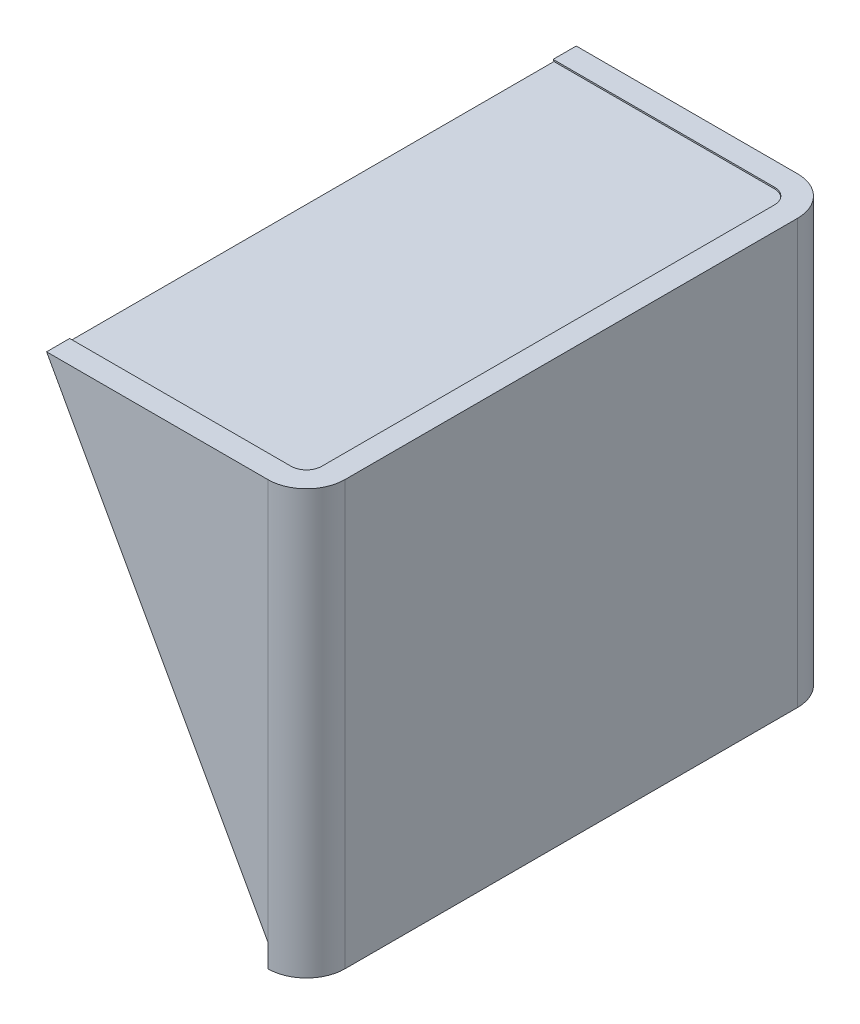
ISO-10303-21;
HEADER;
FILE_DESCRIPTION(('STEP AP214'),'2;1');
FILE_NAME('part.step','',(''),(''),'','','');
FILE_SCHEMA(('AUTOMOTIVE_DESIGN { 1 0 10303 214 1 1 1 1 }'));
ENDSEC;
DATA;
#1=APPLICATION_CONTEXT('core data for automotive mechanical design processes');
#2=APPLICATION_PROTOCOL_DEFINITION('international standard','automotive_design',2000,#1);
#3=PRODUCT_CONTEXT('',#1,'mechanical');
#4=PRODUCT('Part','Part','',(#3));
#5=PRODUCT_RELATED_PRODUCT_CATEGORY('part','',(#4));
#6=PRODUCT_DEFINITION_FORMATION('','',#4);
#7=PRODUCT_DEFINITION_CONTEXT('part definition',#1,'design');
#8=PRODUCT_DEFINITION('design','',#6,#7);
#9=PRODUCT_DEFINITION_SHAPE('','',#8);
#10=(LENGTH_UNIT() NAMED_UNIT(*) SI_UNIT(.MILLI.,.METRE.));
#11=(NAMED_UNIT(*) PLANE_ANGLE_UNIT() SI_UNIT($,.RADIAN.));
#12=(NAMED_UNIT(*) SI_UNIT($,.STERADIAN.) SOLID_ANGLE_UNIT());
#13=UNCERTAINTY_MEASURE_WITH_UNIT(LENGTH_MEASURE(1.E-05),#10,'distance_accuracy_value','');
#14=(GEOMETRIC_REPRESENTATION_CONTEXT(3) GLOBAL_UNCERTAINTY_ASSIGNED_CONTEXT((#13)) GLOBAL_UNIT_ASSIGNED_CONTEXT((#10,
#11,#12)) REPRESENTATION_CONTEXT('',''));
#15=CARTESIAN_POINT('',(0.,0.,0.));
#16=DIRECTION('',(0.,0.,1.));
#17=DIRECTION('',(1.,0.,0.));
#18=AXIS2_PLACEMENT_3D('',#15,#16,#17);
#19=CARTESIAN_POINT('',(47.5,3.,-34.385));
#20=DIRECTION('',(0.875294555883679,0.483590157509841,0.));
#21=DIRECTION('',(-0.483590157509841,0.875294555883679,0.));
#22=AXIS2_PLACEMENT_3D('',#19,#20,#21);
#23=PLANE('',#22);
#24=DIRECTION('',(0.,0.,1.));
#25=VECTOR('',#24,1.);
#26=CARTESIAN_POINT('',(47.5,3.,-34.385));
#27=LINE('',#26,#25);
#28=CARTESIAN_POINT('',(47.5,3.,-34.375));
#29=VERTEX_POINT('',#28);
#30=CARTESIAN_POINT('',(47.5,3.,-31.375));
#31=VERTEX_POINT('',#30);
#32=EDGE_CURVE('E48',#29,#31,#27,.T.);
#33=ORIENTED_EDGE('',*,*,#32,.T.);
#34=DIRECTION('',(-0.483590157509841,0.875294555883679,0.));
#35=VECTOR('',#34,1.);
#36=CARTESIAN_POINT('',(25.4892407283406,42.8393090970996,-31.375));
#37=LINE('',#36,#35);
#38=CARTESIAN_POINT('',(20.5349382977375,51.8065593158347,-31.3750000000004));
#39=VERTEX_POINT('',#38);
#40=EDGE_CURVE('E63',#31,#39,#37,.T.);
#41=ORIENTED_EDGE('',*,*,#40,.T.);
#42=DIRECTION('',(0.,0.,1.));
#43=VECTOR('',#42,1.);
#44=CARTESIAN_POINT('',(20.5349382977375,51.8065593158347,-29.375));
#45=LINE('',#44,#43);
#46=CARTESIAN_POINT('',(20.5349382977375,51.8065593158347,31.375));
#47=VERTEX_POINT('',#46);
#48=EDGE_CURVE('E262',#39,#47,#45,.T.);
#49=ORIENTED_EDGE('',*,*,#48,.T.);
#50=DIRECTION('',(0.483590157509841,-0.875294555883679,0.));
#51=VECTOR('',#50,1.);
#52=CARTESIAN_POINT('',(25.4892407283406,42.8393090970996,31.375));
#53=LINE('',#52,#51);
#54=CARTESIAN_POINT('',(47.5,3.,31.375));
#55=VERTEX_POINT('',#54);
#56=EDGE_CURVE('E55',#47,#55,#53,.T.);
#57=ORIENTED_EDGE('',*,*,#56,.T.);
#58=CARTESIAN_POINT('',(47.5,3.,34.375));
#59=VERTEX_POINT('',#58);
#60=EDGE_CURVE('E11',#55,#59,#27,.T.);
#61=ORIENTED_EDGE('',*,*,#60,.T.);
#62=DIRECTION('',(0.483590157509841,-0.875294555883679,0.));
#63=VECTOR('',#62,1.);
#64=CARTESIAN_POINT('',(25.4892407283406,42.8393090970996,34.375));
#65=LINE('',#64,#63);
#66=CARTESIAN_POINT('',(18.7705991126334,55.,34.375));
#67=VERTEX_POINT('',#66);
#68=EDGE_CURVE('E267',#67,#59,#65,.T.);
#69=ORIENTED_EDGE('',*,*,#68,.F.);
#70=DIRECTION('',(0.,0.,1.));
#71=VECTOR('',#70,1.);
#72=CARTESIAN_POINT('',(18.7705991126334,55.,29.375));
#73=LINE('',#72,#71);
#74=CARTESIAN_POINT('',(18.7705991126334,55.,31.375));
#75=VERTEX_POINT('',#74);
#76=EDGE_CURVE('E269',#75,#67,#73,.T.);
#77=ORIENTED_EDGE('',*,*,#76,.F.);
#78=DIRECTION('',(0.483590157509841,-0.875294555883679,0.));
#79=VECTOR('',#78,1.);
#80=CARTESIAN_POINT('',(25.4892407283406,42.8393090970996,31.375));
#81=LINE('',#80,#79);
#82=CARTESIAN_POINT('',(18.8774728619278,54.8065593158347,31.375));
#83=VERTEX_POINT('',#82);
#84=EDGE_CURVE('E273',#75,#83,#81,.T.);
#85=ORIENTED_EDGE('',*,*,#84,.T.);
#86=DIRECTION('',(0.,0.,1.));
#87=VECTOR('',#86,1.);
#88=CARTESIAN_POINT('',(18.8774728619278,54.8065593158347,-29.375));
#89=LINE('',#88,#87);
#90=CARTESIAN_POINT('',(18.8774728619278,54.8065593158347,-31.3750000000004));
#91=VERTEX_POINT('',#90);
#92=EDGE_CURVE('E261',#91,#83,#89,.T.);
#93=ORIENTED_EDGE('',*,*,#92,.F.);
#94=DIRECTION('',(-0.483590157509841,0.875294555883679,0.));
#95=VECTOR('',#94,1.);
#96=CARTESIAN_POINT('',(25.4892407283406,42.8393090970996,-31.375));
#97=LINE('',#96,#95);
#98=CARTESIAN_POINT('',(18.7705991126334,55.,-31.375));
#99=VERTEX_POINT('',#98);
#100=EDGE_CURVE('E277',#91,#99,#97,.T.);
#101=ORIENTED_EDGE('',*,*,#100,.T.);
#102=CARTESIAN_POINT('',(18.7705991126334,55.,-34.375));
#103=VERTEX_POINT('',#102);
#104=EDGE_CURVE('E271',#103,#99,#73,.T.);
#105=ORIENTED_EDGE('',*,*,#104,.F.);
#106=DIRECTION('',(-0.483590157509841,0.875294555883679,0.));
#107=VECTOR('',#106,1.);
#108=CARTESIAN_POINT('',(25.4892407283406,42.8393090970996,-34.375));
#109=LINE('',#108,#107);
#110=EDGE_CURVE('E43',#29,#103,#109,.T.);
#111=ORIENTED_EDGE('',*,*,#110,.F.);
#112=EDGE_LOOP('',(#33,#41,#49,#57,#61,#69,#77,#85,#93,#101,#105,#111));
#113=FACE_BOUND('',#112,.T.);
#114=ADVANCED_FACE('F39',(#113),#23,.F.);
#115=CARTESIAN_POINT('',(47.5,0.,-34.385));
#116=DIRECTION('',(1.,0.,0.));
#117=DIRECTION('',(0.,0.,-1.));
#118=AXIS2_PLACEMENT_3D('',#115,#116,#117);
#119=PLANE('',#118);
#120=DIRECTION('',(0.,0.,1.));
#121=VECTOR('',#120,1.);
#122=CARTESIAN_POINT('',(47.5,0.,29.375));
#123=LINE('',#122,#121);
#124=CARTESIAN_POINT('',(47.5,0.,-34.375));
#125=VERTEX_POINT('',#124);
#126=CARTESIAN_POINT('',(47.5,0.,34.375));
#127=VERTEX_POINT('',#126);
#128=EDGE_CURVE('E264',#125,#127,#123,.T.);
#129=ORIENTED_EDGE('',*,*,#128,.T.);
#130=DIRECTION('',(0.,-1.,0.));
#131=VECTOR('',#130,1.);
#132=CARTESIAN_POINT('',(47.5,55.,34.375));
#133=LINE('',#132,#131);
#134=EDGE_CURVE('E257',#59,#127,#133,.T.);
#135=ORIENTED_EDGE('',*,*,#134,.F.);
#136=ORIENTED_EDGE('',*,*,#60,.F.);
#137=DIRECTION('',(0.,0.,1.));
#138=VECTOR('',#137,1.);
#139=CARTESIAN_POINT('',(47.5,3.,29.375));
#140=LINE('',#139,#138);
#141=EDGE_CURVE('E272',#31,#55,#140,.T.);
#142=ORIENTED_EDGE('',*,*,#141,.F.);
#143=ORIENTED_EDGE('',*,*,#32,.F.);
#144=DIRECTION('',(0.,-1.,0.));
#145=VECTOR('',#144,1.);
#146=CARTESIAN_POINT('',(47.5,55.,-34.375));
#147=LINE('',#146,#145);
#148=EDGE_CURVE('E251',#29,#125,#147,.T.);
#149=ORIENTED_EDGE('',*,*,#148,.T.);
#150=EDGE_LOOP('',(#129,#135,#136,#142,#143,#149));
#151=FACE_BOUND('',#150,.T.);
#152=ADVANCED_FACE('F41',(#151),#119,.F.);
#153=CARTESIAN_POINT('',(47.5,55.,31.375));
#154=DIRECTION('',(0.,0.,-1.));
#155=DIRECTION('',(-1.,0.,0.));
#156=AXIS2_PLACEMENT_3D('',#153,#154,#155);
#157=PLANE('',#156);
#158=ORIENTED_EDGE('',*,*,#56,.F.);
#159=DIRECTION('',(1.,0.,0.));
#160=VECTOR('',#159,1.);
#161=CARTESIAN_POINT('',(18.7705991126334,51.8065593158347,31.375));
#162=LINE('',#161,#160);
#163=CARTESIAN_POINT('',(47.5,51.8065593158347,31.375));
#164=VERTEX_POINT('',#163);
#165=EDGE_CURVE('E329',#47,#164,#162,.T.);
#166=ORIENTED_EDGE('',*,*,#165,.T.);
#167=DIRECTION('',(0.,-1.,0.));
#168=VECTOR('',#167,1.);
#169=CARTESIAN_POINT('',(47.5,55.,31.375));
#170=LINE('',#169,#168);
#171=EDGE_CURVE('E208',#164,#55,#170,.T.);
#172=ORIENTED_EDGE('',*,*,#171,.T.);
#173=EDGE_LOOP('',(#158,#166,#172));
#174=FACE_BOUND('',#173,.T.);
#175=ADVANCED_FACE('F338',(#174),#157,.T.);
#176=CARTESIAN_POINT('',(47.5,55.,29.375));
#177=DIRECTION('',(0.,-1.,0.));
#178=DIRECTION('',(0.,0.,-1.));
#179=AXIS2_PLACEMENT_3D('',#176,#177,#178);
#180=CYLINDRICAL_SURFACE('',#179,2.);
#181=CARTESIAN_POINT('',(47.5,51.8065593158347,29.375));
#182=DIRECTION('',(0.,1.,0.));
#183=DIRECTION('',(0.,0.,-1.));
#184=AXIS2_PLACEMENT_3D('',#181,#182,#183);
#185=CIRCLE('',#184,2.00000000000001);
#186=CARTESIAN_POINT('',(49.5,51.8065593158347,29.375));
#187=VERTEX_POINT('',#186);
#188=EDGE_CURVE('E182',#164,#187,#185,.T.);
#189=ORIENTED_EDGE('',*,*,#188,.T.);
#190=DIRECTION('',(0.,1.,0.));
#191=VECTOR('',#190,1.);
#192=CARTESIAN_POINT('',(49.5,55.,29.375));
#193=LINE('',#192,#191);
#194=CARTESIAN_POINT('',(49.5,3.,29.375));
#195=VERTEX_POINT('',#194);
#196=EDGE_CURVE('E179',#187,#195,#193,.F.);
#197=ORIENTED_EDGE('',*,*,#196,.T.);
#198=CARTESIAN_POINT('',(47.5,3.,29.375));
#199=DIRECTION('',(0.,-1.,0.));
#200=DIRECTION('',(0.,0.,-1.));
#201=AXIS2_PLACEMENT_3D('',#198,#199,#200);
#202=CIRCLE('',#201,2.);
#203=EDGE_CURVE('E187',#55,#195,#202,.F.);
#204=ORIENTED_EDGE('',*,*,#203,.F.);
#205=ORIENTED_EDGE('',*,*,#171,.F.);
#206=EDGE_LOOP('',(#189,#197,#204,#205));
#207=FACE_BOUND('',#206,.T.);
#208=ADVANCED_FACE('F334',(#207),#180,.F.);
#209=CARTESIAN_POINT('',(49.5,55.,29.375));
#210=DIRECTION('',(-1.,0.,0.));
#211=DIRECTION('',(0.,0.,1.));
#212=AXIS2_PLACEMENT_3D('',#209,#210,#211);
#213=PLANE('',#212);
#214=DIRECTION('',(0.,0.,-1.));
#215=VECTOR('',#214,1.);
#216=CARTESIAN_POINT('',(49.5,51.8065593158347,-29.375));
#217=LINE('',#216,#215);
#218=CARTESIAN_POINT('',(49.5,51.8065593158347,-29.375));
#219=VERTEX_POINT('',#218);
#220=EDGE_CURVE('E177',#187,#219,#217,.T.);
#221=ORIENTED_EDGE('',*,*,#220,.T.);
#222=DIRECTION('',(0.,-1.,0.));
#223=VECTOR('',#222,1.);
#224=CARTESIAN_POINT('',(49.5,55.,-29.375));
#225=LINE('',#224,#223);
#226=CARTESIAN_POINT('',(49.5,3.,-29.375));
#227=VERTEX_POINT('',#226);
#228=EDGE_CURVE('E161',#219,#227,#225,.T.);
#229=ORIENTED_EDGE('',*,*,#228,.T.);
#230=DIRECTION('',(0.,0.,-1.));
#231=VECTOR('',#230,1.);
#232=CARTESIAN_POINT('',(49.5,3.,29.375));
#233=LINE('',#232,#231);
#234=EDGE_CURVE('E190',#195,#227,#233,.T.);
#235=ORIENTED_EDGE('',*,*,#234,.F.);
#236=ORIENTED_EDGE('',*,*,#196,.F.);
#237=EDGE_LOOP('',(#221,#229,#235,#236));
#238=FACE_BOUND('',#237,.T.);
#239=ADVANCED_FACE('F178',(#238),#213,.T.);
#240=CARTESIAN_POINT('',(47.5,55.,-29.375));
#241=DIRECTION('',(0.,-1.,0.));
#242=DIRECTION('',(0.,0.,-1.));
#243=AXIS2_PLACEMENT_3D('',#240,#241,#242);
#244=CYLINDRICAL_SURFACE('',#243,2.);
#245=CARTESIAN_POINT('',(47.5,51.8065593158347,-29.375));
#246=DIRECTION('',(0.,1.,0.));
#247=DIRECTION('',(0.,0.,-1.));
#248=AXIS2_PLACEMENT_3D('',#245,#246,#247);
#249=CIRCLE('',#248,2.00000000000003);
#250=CARTESIAN_POINT('',(47.5,51.8065593158347,-31.375));
#251=VERTEX_POINT('',#250);
#252=EDGE_CURVE('E166',#219,#251,#249,.T.);
#253=ORIENTED_EDGE('',*,*,#252,.T.);
#254=DIRECTION('',(0.,1.,0.));
#255=VECTOR('',#254,1.);
#256=CARTESIAN_POINT('',(47.5,55.,-31.375));
#257=LINE('',#256,#255);
#258=EDGE_CURVE('E219',#251,#31,#257,.F.);
#259=ORIENTED_EDGE('',*,*,#258,.T.);
#260=CARTESIAN_POINT('',(47.5,3.,-29.375));
#261=DIRECTION('',(0.,-1.,0.));
#262=DIRECTION('',(0.,0.,-1.));
#263=AXIS2_PLACEMENT_3D('',#260,#261,#262);
#264=CIRCLE('',#263,2.);
#265=EDGE_CURVE('E168',#227,#31,#264,.F.);
#266=ORIENTED_EDGE('',*,*,#265,.F.);
#267=ORIENTED_EDGE('',*,*,#228,.F.);
#268=EDGE_LOOP('',(#253,#259,#266,#267));
#269=FACE_BOUND('',#268,.T.);
#270=ADVANCED_FACE('F163',(#269),#244,.F.);
#271=CARTESIAN_POINT('',(47.5,55.,-31.375));
#272=DIRECTION('',(0.,0.,1.));
#273=DIRECTION('',(1.,0.,0.));
#274=AXIS2_PLACEMENT_3D('',#271,#272,#273);
#275=PLANE('',#274);
#276=ORIENTED_EDGE('',*,*,#40,.F.);
#277=ORIENTED_EDGE('',*,*,#258,.F.);
#278=DIRECTION('',(-1.,0.,0.));
#279=VECTOR('',#278,1.);
#280=CARTESIAN_POINT('',(18.7705991126334,51.8065593158347,-31.3750000000004));
#281=LINE('',#280,#279);
#282=EDGE_CURVE('E186',#251,#39,#281,.T.);
#283=ORIENTED_EDGE('',*,*,#282,.T.);
#284=EDGE_LOOP('',(#276,#277,#283));
#285=FACE_BOUND('',#284,.T.);
#286=ADVANCED_FACE('F328',(#285),#275,.T.);
#287=CARTESIAN_POINT('',(47.5,51.8065593158347,-29.375));
#288=DIRECTION('',(0.,-1.,0.));
#289=DIRECTION('',(0.,0.,-1.));
#290=AXIS2_PLACEMENT_3D('',#287,#288,#289);
#291=PLANE('',#290);
#292=ORIENTED_EDGE('',*,*,#48,.F.);
#293=ORIENTED_EDGE('',*,*,#282,.F.);
#294=ORIENTED_EDGE('',*,*,#252,.F.);
#295=ORIENTED_EDGE('',*,*,#220,.F.);
#296=ORIENTED_EDGE('',*,*,#188,.F.);
#297=ORIENTED_EDGE('',*,*,#165,.F.);
#298=EDGE_LOOP('',(#292,#293,#294,#295,#296,#297));
#299=FACE_BOUND('',#298,.T.);
#300=ADVANCED_FACE('F185',(#299),#291,.T.);
#301=CARTESIAN_POINT('',(-47.5,3.,29.375));
#302=DIRECTION('',(0.,-1.,0.));
#303=DIRECTION('',(0.,0.,-1.));
#304=AXIS2_PLACEMENT_3D('',#301,#302,#303);
#305=PLANE('',#304);
#306=ORIENTED_EDGE('',*,*,#265,.T.);
#307=ORIENTED_EDGE('',*,*,#141,.T.);
#308=ORIENTED_EDGE('',*,*,#203,.T.);
#309=ORIENTED_EDGE('',*,*,#234,.T.);
#310=EDGE_LOOP('',(#306,#307,#308,#309));
#311=FACE_BOUND('',#310,.T.);
#312=ADVANCED_FACE('F376',(#311),#305,.F.);
#313=CARTESIAN_POINT('',(47.5,55.,-31.375));
#314=VERTEX_POINT('',#313);
#315=CARTESIAN_POINT('',(47.5,54.8065593158347,-31.375));
#316=VERTEX_POINT('',#315);
#317=EDGE_CURVE('E173',#314,#316,#257,.F.);
#318=ORIENTED_EDGE('',*,*,#317,.T.);
#319=CARTESIAN_POINT('',(47.5,54.8065593158347,-29.375));
#320=DIRECTION('',(0.,1.,0.));
#321=DIRECTION('',(0.,0.,-1.));
#322=AXIS2_PLACEMENT_3D('',#319,#320,#321);
#323=CIRCLE('',#322,2.00000000000003);
#324=CARTESIAN_POINT('',(49.5,54.8065593158347,-29.375));
#325=VERTEX_POINT('',#324);
#326=EDGE_CURVE('E203',#325,#316,#323,.T.);
#327=ORIENTED_EDGE('',*,*,#326,.F.);
#328=CARTESIAN_POINT('',(49.5,55.,-29.375));
#329=VERTEX_POINT('',#328);
#330=EDGE_CURVE('E172',#329,#325,#225,.T.);
#331=ORIENTED_EDGE('',*,*,#330,.F.);
#332=CARTESIAN_POINT('',(47.5,55.,-29.375));
#333=DIRECTION('',(0.,-1.,0.));
#334=DIRECTION('',(0.,0.,-1.));
#335=AXIS2_PLACEMENT_3D('',#332,#333,#334);
#336=CIRCLE('',#335,2.);
#337=EDGE_CURVE('E225',#329,#314,#336,.F.);
#338=ORIENTED_EDGE('',*,*,#337,.T.);
#339=EDGE_LOOP('',(#318,#327,#331,#338));
#340=FACE_BOUND('',#339,.T.);
#341=ADVANCED_FACE('F307',(#340),#244,.F.);
#342=ORIENTED_EDGE('',*,*,#330,.T.);
#343=DIRECTION('',(0.,0.,-1.));
#344=VECTOR('',#343,1.);
#345=CARTESIAN_POINT('',(49.5,54.8065593158347,-29.375));
#346=LINE('',#345,#344);
#347=CARTESIAN_POINT('',(49.5,54.8065593158347,29.375));
#348=VERTEX_POINT('',#347);
#349=EDGE_CURVE('E201',#348,#325,#346,.T.);
#350=ORIENTED_EDGE('',*,*,#349,.F.);
#351=CARTESIAN_POINT('',(49.5,55.,29.375));
#352=VERTEX_POINT('',#351);
#353=EDGE_CURVE('E210',#352,#348,#193,.F.);
#354=ORIENTED_EDGE('',*,*,#353,.F.);
#355=DIRECTION('',(0.,0.,-1.));
#356=VECTOR('',#355,1.);
#357=CARTESIAN_POINT('',(49.5,55.,29.375));
#358=LINE('',#357,#356);
#359=EDGE_CURVE('E223',#352,#329,#358,.T.);
#360=ORIENTED_EDGE('',*,*,#359,.T.);
#361=EDGE_LOOP('',(#342,#350,#354,#360));
#362=FACE_BOUND('',#361,.T.);
#363=ADVANCED_FACE('F299',(#362),#213,.T.);
#364=ORIENTED_EDGE('',*,*,#353,.T.);
#365=CARTESIAN_POINT('',(47.5,54.8065593158347,29.375));
#366=DIRECTION('',(0.,1.,0.));
#367=DIRECTION('',(0.,0.,-1.));
#368=AXIS2_PLACEMENT_3D('',#365,#366,#367);
#369=CIRCLE('',#368,2.00000000000001);
#370=CARTESIAN_POINT('',(47.5,54.8065593158347,31.375));
#371=VERTEX_POINT('',#370);
#372=EDGE_CURVE('E199',#371,#348,#369,.T.);
#373=ORIENTED_EDGE('',*,*,#372,.F.);
#374=CARTESIAN_POINT('',(47.5,55.,31.375));
#375=VERTEX_POINT('',#374);
#376=EDGE_CURVE('E205',#375,#371,#170,.T.);
#377=ORIENTED_EDGE('',*,*,#376,.F.);
#378=CARTESIAN_POINT('',(47.5,55.,29.375));
#379=DIRECTION('',(0.,-1.,0.));
#380=DIRECTION('',(0.,0.,-1.));
#381=AXIS2_PLACEMENT_3D('',#378,#379,#380);
#382=CIRCLE('',#381,2.);
#383=EDGE_CURVE('E221',#375,#352,#382,.F.);
#384=ORIENTED_EDGE('',*,*,#383,.T.);
#385=EDGE_LOOP('',(#364,#373,#377,#384));
#386=FACE_BOUND('',#385,.T.);
#387=ADVANCED_FACE('F294',(#386),#180,.F.);
#388=ORIENTED_EDGE('',*,*,#84,.F.);
#389=DIRECTION('',(1.,0.,0.));
#390=VECTOR('',#389,1.);
#391=CARTESIAN_POINT('',(-47.5,55.,31.375));
#392=LINE('',#391,#390);
#393=EDGE_CURVE('E216',#75,#375,#392,.T.);
#394=ORIENTED_EDGE('',*,*,#393,.T.);
#395=ORIENTED_EDGE('',*,*,#376,.T.);
#396=DIRECTION('',(1.,0.,0.));
#397=VECTOR('',#396,1.);
#398=CARTESIAN_POINT('',(18.7705991126334,54.8065593158347,31.375));
#399=LINE('',#398,#397);
#400=EDGE_CURVE('E197',#83,#371,#399,.T.);
#401=ORIENTED_EDGE('',*,*,#400,.F.);
#402=EDGE_LOOP('',(#388,#394,#395,#401));
#403=FACE_BOUND('',#402,.T.);
#404=ADVANCED_FACE('F287',(#403),#157,.T.);
#405=ORIENTED_EDGE('',*,*,#100,.F.);
#406=DIRECTION('',(-1.,0.,0.));
#407=VECTOR('',#406,1.);
#408=CARTESIAN_POINT('',(18.7705991126334,54.8065593158347,-31.3750000000004));
#409=LINE('',#408,#407);
#410=EDGE_CURVE('E194',#316,#91,#409,.T.);
#411=ORIENTED_EDGE('',*,*,#410,.F.);
#412=ORIENTED_EDGE('',*,*,#317,.F.);
#413=DIRECTION('',(-1.,0.,0.));
#414=VECTOR('',#413,1.);
#415=CARTESIAN_POINT('',(-47.5,55.,-31.375));
#416=LINE('',#415,#414);
#417=EDGE_CURVE('E227',#314,#99,#416,.T.);
#418=ORIENTED_EDGE('',*,*,#417,.T.);
#419=EDGE_LOOP('',(#405,#411,#412,#418));
#420=FACE_BOUND('',#419,.T.);
#421=ADVANCED_FACE('F311',(#420),#275,.T.);
#422=CARTESIAN_POINT('',(47.5,54.8065593158347,-29.375));
#423=DIRECTION('',(0.,-1.,0.));
#424=DIRECTION('',(0.,0.,-1.));
#425=AXIS2_PLACEMENT_3D('',#422,#423,#424);
#426=PLANE('',#425);
#427=ORIENTED_EDGE('',*,*,#410,.T.);
#428=ORIENTED_EDGE('',*,*,#92,.T.);
#429=ORIENTED_EDGE('',*,*,#400,.T.);
#430=ORIENTED_EDGE('',*,*,#372,.T.);
#431=ORIENTED_EDGE('',*,*,#349,.T.);
#432=ORIENTED_EDGE('',*,*,#326,.T.);
#433=EDGE_LOOP('',(#427,#428,#429,#430,#431,#432));
#434=FACE_BOUND('',#433,.T.);
#435=ADVANCED_FACE('F291',(#434),#426,.F.);
#436=CARTESIAN_POINT('',(47.5,55.,34.375));
#437=DIRECTION('',(0.,0.,-1.));
#438=DIRECTION('',(-1.,0.,0.));
#439=AXIS2_PLACEMENT_3D('',#436,#437,#438);
#440=PLANE('',#439);
#441=DIRECTION('',(1.,0.,0.));
#442=VECTOR('',#441,1.);
#443=CARTESIAN_POINT('',(47.5,55.,34.375));
#444=LINE('',#443,#442);
#445=CARTESIAN_POINT('',(47.5,55.,34.375));
#446=VERTEX_POINT('',#445);
#447=EDGE_CURVE('E230',#67,#446,#444,.T.);
#448=ORIENTED_EDGE('',*,*,#447,.F.);
#449=ORIENTED_EDGE('',*,*,#68,.T.);
#450=EDGE_CURVE('E258',#446,#59,#133,.T.);
#451=ORIENTED_EDGE('',*,*,#450,.F.);
#452=EDGE_LOOP('',(#448,#449,#451));
#453=FACE_BOUND('',#452,.T.);
#454=ADVANCED_FACE('F354',(#453),#440,.F.);
#455=CARTESIAN_POINT('',(-47.5,55.,29.375));
#456=DIRECTION('',(0.,-1.,0.));
#457=DIRECTION('',(0.,0.,-1.));
#458=AXIS2_PLACEMENT_3D('',#455,#456,#457);
#459=PLANE('',#458);
#460=DIRECTION('',(-1.,0.,0.));
#461=VECTOR('',#460,1.);
#462=CARTESIAN_POINT('',(47.5,55.,-34.375));
#463=LINE('',#462,#461);
#464=CARTESIAN_POINT('',(47.5,55.,-34.375));
#465=VERTEX_POINT('',#464);
#466=EDGE_CURVE('E239',#465,#103,#463,.T.);
#467=ORIENTED_EDGE('',*,*,#466,.T.);
#468=ORIENTED_EDGE('',*,*,#104,.T.);
#469=ORIENTED_EDGE('',*,*,#417,.F.);
#470=ORIENTED_EDGE('',*,*,#337,.F.);
#471=ORIENTED_EDGE('',*,*,#359,.F.);
#472=ORIENTED_EDGE('',*,*,#383,.F.);
#473=ORIENTED_EDGE('',*,*,#393,.F.);
#474=ORIENTED_EDGE('',*,*,#76,.T.);
#475=ORIENTED_EDGE('',*,*,#447,.T.);
#476=CARTESIAN_POINT('',(47.5,55.,29.375));
#477=DIRECTION('',(0.,1.,0.));
#478=DIRECTION('',(0.,0.,1.));
#479=AXIS2_PLACEMENT_3D('',#476,#477,#478);
#480=CIRCLE('',#479,5.);
#481=CARTESIAN_POINT('',(52.5,55.,29.375));
#482=VERTEX_POINT('',#481);
#483=EDGE_CURVE('E232',#446,#482,#480,.T.);
#484=ORIENTED_EDGE('',*,*,#483,.T.);
#485=DIRECTION('',(0.,0.,-1.));
#486=VECTOR('',#485,1.);
#487=CARTESIAN_POINT('',(52.5,55.,29.375));
#488=LINE('',#487,#486);
#489=CARTESIAN_POINT('',(52.5,55.,-29.375));
#490=VERTEX_POINT('',#489);
#491=EDGE_CURVE('E235',#482,#490,#488,.T.);
#492=ORIENTED_EDGE('',*,*,#491,.T.);
#493=CARTESIAN_POINT('',(47.5,55.,-29.375));
#494=DIRECTION('',(0.,1.,0.));
#495=DIRECTION('',(0.,0.,1.));
#496=AXIS2_PLACEMENT_3D('',#493,#494,#495);
#497=CIRCLE('',#496,5.);
#498=EDGE_CURVE('E237',#490,#465,#497,.T.);
#499=ORIENTED_EDGE('',*,*,#498,.T.);
#500=EDGE_LOOP('',(#467,#468,#469,#470,#471,#472,#473,#474,#475,#484,#492,#499));
#501=FACE_BOUND('',#500,.T.);
#502=ADVANCED_FACE('F303',(#501),#459,.F.);
#503=CARTESIAN_POINT('',(47.5,55.,29.375));
#504=DIRECTION('',(0.,-1.,0.));
#505=DIRECTION('',(0.,0.,-1.));
#506=AXIS2_PLACEMENT_3D('',#503,#504,#505);
#507=CYLINDRICAL_SURFACE('',#506,5.);
#508=CARTESIAN_POINT('',(47.5,0.,29.375));
#509=DIRECTION('',(0.,1.,0.));
#510=DIRECTION('',(0.,0.,1.));
#511=AXIS2_PLACEMENT_3D('',#508,#509,#510);
#512=CIRCLE('',#511,5.);
#513=CARTESIAN_POINT('',(52.5,0.,29.375));
#514=VERTEX_POINT('',#513);
#515=EDGE_CURVE('E207',#127,#514,#512,.T.);
#516=ORIENTED_EDGE('',*,*,#515,.T.);
#517=DIRECTION('',(0.,-1.,0.));
#518=VECTOR('',#517,1.);
#519=CARTESIAN_POINT('',(52.5,55.,29.375));
#520=LINE('',#519,#518);
#521=EDGE_CURVE('E254',#482,#514,#520,.T.);
#522=ORIENTED_EDGE('',*,*,#521,.F.);
#523=ORIENTED_EDGE('',*,*,#483,.F.);
#524=ORIENTED_EDGE('',*,*,#450,.T.);
#525=ORIENTED_EDGE('',*,*,#134,.T.);
#526=EDGE_LOOP('',(#516,#522,#523,#524,#525));
#527=FACE_BOUND('',#526,.T.);
#528=ADVANCED_FACE('F358',(#527),#507,.T.);
#529=CARTESIAN_POINT('',(52.5,55.,29.375));
#530=DIRECTION('',(-1.,0.,0.));
#531=DIRECTION('',(0.,0.,1.));
#532=AXIS2_PLACEMENT_3D('',#529,#530,#531);
#533=PLANE('',#532);
#534=DIRECTION('',(0.,0.,-1.));
#535=VECTOR('',#534,1.);
#536=CARTESIAN_POINT('',(52.5,0.,29.375));
#537=LINE('',#536,#535);
#538=CARTESIAN_POINT('',(52.5,0.,-29.375));
#539=VERTEX_POINT('',#538);
#540=EDGE_CURVE('E244',#514,#539,#537,.T.);
#541=ORIENTED_EDGE('',*,*,#540,.T.);
#542=DIRECTION('',(0.,-1.,0.));
#543=VECTOR('',#542,1.);
#544=CARTESIAN_POINT('',(52.5,55.,-29.375));
#545=LINE('',#544,#543);
#546=EDGE_CURVE('E250',#490,#539,#545,.T.);
#547=ORIENTED_EDGE('',*,*,#546,.F.);
#548=ORIENTED_EDGE('',*,*,#491,.F.);
#549=ORIENTED_EDGE('',*,*,#521,.T.);
#550=EDGE_LOOP('',(#541,#547,#548,#549));
#551=FACE_BOUND('',#550,.T.);
#552=ADVANCED_FACE('F361',(#551),#533,.F.);
#553=CARTESIAN_POINT('',(47.5,55.,-29.375));
#554=DIRECTION('',(0.,-1.,0.));
#555=DIRECTION('',(0.,0.,-1.));
#556=AXIS2_PLACEMENT_3D('',#553,#554,#555);
#557=CYLINDRICAL_SURFACE('',#556,5.);
#558=CARTESIAN_POINT('',(47.5,0.,-29.375));
#559=DIRECTION('',(0.,1.,0.));
#560=DIRECTION('',(0.,0.,1.));
#561=AXIS2_PLACEMENT_3D('',#558,#559,#560);
#562=CIRCLE('',#561,5.);
#563=EDGE_CURVE('E233',#539,#125,#562,.T.);
#564=ORIENTED_EDGE('',*,*,#563,.T.);
#565=ORIENTED_EDGE('',*,*,#148,.F.);
#566=EDGE_CURVE('E242',#465,#29,#147,.T.);
#567=ORIENTED_EDGE('',*,*,#566,.F.);
#568=ORIENTED_EDGE('',*,*,#498,.F.);
#569=ORIENTED_EDGE('',*,*,#546,.T.);
#570=EDGE_LOOP('',(#564,#565,#567,#568,#569));
#571=FACE_BOUND('',#570,.T.);
#572=ADVANCED_FACE('F320',(#571),#557,.T.);
#573=CARTESIAN_POINT('',(-47.5,0.,29.375));
#574=DIRECTION('',(0.,-1.,0.));
#575=DIRECTION('',(0.,0.,-1.));
#576=AXIS2_PLACEMENT_3D('',#573,#574,#575);
#577=PLANE('',#576);
#578=ORIENTED_EDGE('',*,*,#128,.F.);
#579=ORIENTED_EDGE('',*,*,#563,.F.);
#580=ORIENTED_EDGE('',*,*,#540,.F.);
#581=ORIENTED_EDGE('',*,*,#515,.F.);
#582=EDGE_LOOP('',(#578,#579,#580,#581));
#583=FACE_BOUND('',#582,.T.);
#584=ADVANCED_FACE('F368',(#583),#577,.T.);
#585=CARTESIAN_POINT('',(47.5,55.,-34.375));
#586=DIRECTION('',(0.,0.,1.));
#587=DIRECTION('',(1.,0.,0.));
#588=AXIS2_PLACEMENT_3D('',#585,#586,#587);
#589=PLANE('',#588);
#590=ORIENTED_EDGE('',*,*,#566,.T.);
#591=ORIENTED_EDGE('',*,*,#110,.T.);
#592=ORIENTED_EDGE('',*,*,#466,.F.);
#593=EDGE_LOOP('',(#590,#591,#592));
#594=FACE_BOUND('',#593,.T.);
#595=ADVANCED_FACE('F318',(#594),#589,.F.);
#596=CLOSED_SHELL('',(#114,#152,#175,#208,#239,#270,#286,#300,#312,#341,#363,#387,#404,#421,
#435,#454,#502,#528,#552,#572,#584,#595));
#597=MANIFOLD_SOLID_BREP('B2',#596);
#598=ADVANCED_BREP_SHAPE_REPRESENTATION('',(#18,#597),#14);
#599=SHAPE_DEFINITION_REPRESENTATION(#9,#598);
ENDSEC;
END-ISO-10303-21;
